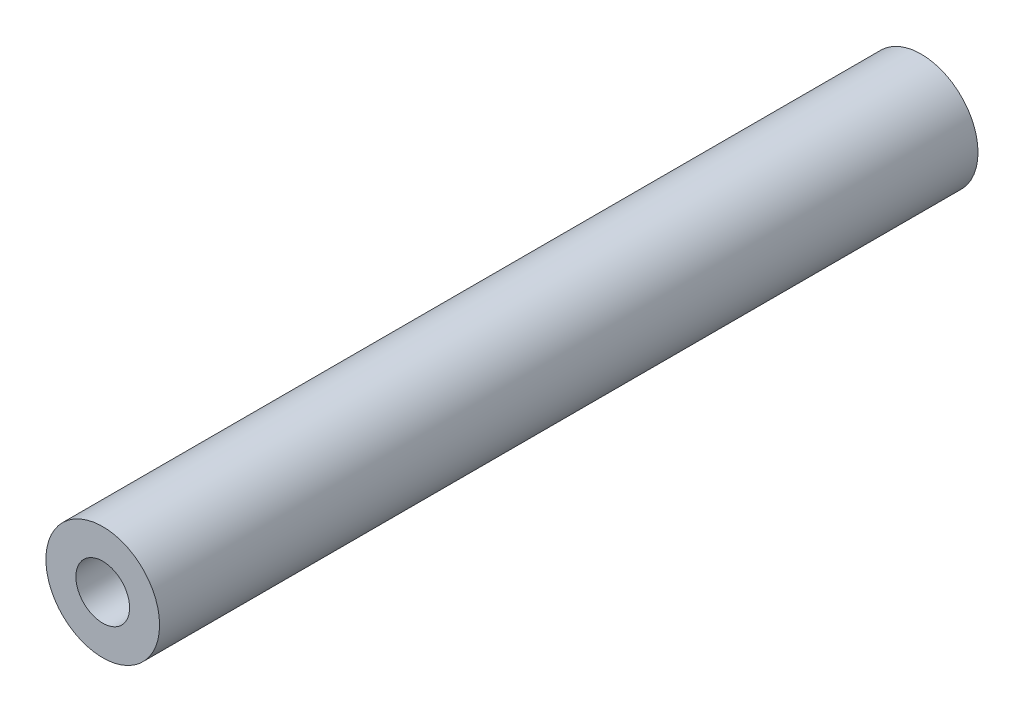
ISO-10303-21;
HEADER;
FILE_DESCRIPTION(('STEP AP214'),'2;1');
FILE_NAME('part.step','',(''),(''),'','','');
FILE_SCHEMA(('AUTOMOTIVE_DESIGN { 1 0 10303 214 1 1 1 1 }'));
ENDSEC;
DATA;
#1=APPLICATION_CONTEXT('core data for automotive mechanical design processes');
#2=APPLICATION_PROTOCOL_DEFINITION('international standard','automotive_design',2000,#1);
#3=PRODUCT_CONTEXT('',#1,'mechanical');
#4=PRODUCT('Part','Part','',(#3));
#5=PRODUCT_RELATED_PRODUCT_CATEGORY('part','',(#4));
#6=PRODUCT_DEFINITION_FORMATION('','',#4);
#7=PRODUCT_DEFINITION_CONTEXT('part definition',#1,'design');
#8=PRODUCT_DEFINITION('design','',#6,#7);
#9=PRODUCT_DEFINITION_SHAPE('','',#8);
#10=(LENGTH_UNIT() NAMED_UNIT(*) SI_UNIT(.MILLI.,.METRE.));
#11=(NAMED_UNIT(*) PLANE_ANGLE_UNIT() SI_UNIT($,.RADIAN.));
#12=(NAMED_UNIT(*) SI_UNIT($,.STERADIAN.) SOLID_ANGLE_UNIT());
#13=UNCERTAINTY_MEASURE_WITH_UNIT(LENGTH_MEASURE(1.E-05),#10,'distance_accuracy_value','');
#14=(GEOMETRIC_REPRESENTATION_CONTEXT(3) GLOBAL_UNCERTAINTY_ASSIGNED_CONTEXT((#13)) GLOBAL_UNIT_ASSIGNED_CONTEXT((#10,
#11,#12)) REPRESENTATION_CONTEXT('',''));
#15=CARTESIAN_POINT('',(0.,0.,0.));
#16=DIRECTION('',(0.,0.,1.));
#17=DIRECTION('',(1.,0.,0.));
#18=AXIS2_PLACEMENT_3D('',#15,#16,#17);
#19=CARTESIAN_POINT('',(0.,0.,45.72));
#20=DIRECTION('',(0.,0.,1.));
#21=DIRECTION('',(1.,0.,0.));
#22=AXIS2_PLACEMENT_3D('',#19,#20,#21);
#23=PLANE('',#22);
#24=CARTESIAN_POINT('',(0.,0.,45.72));
#25=DIRECTION('',(0.,0.,1.));
#26=DIRECTION('',(1.,0.,0.));
#27=AXIS2_PLACEMENT_3D('',#24,#25,#26);
#28=CIRCLE('',#27,3.175);
#29=CARTESIAN_POINT('',(3.175,0.,45.72));
#30=VERTEX_POINT('',#29);
#31=EDGE_CURVE('E10',#30,#30,#28,.T.);
#32=ORIENTED_EDGE('',*,*,#31,.T.);
#33=EDGE_LOOP('',(#32));
#34=FACE_BOUND('',#33,.T.);
#35=CARTESIAN_POINT('',(0.,0.,45.72));
#36=DIRECTION('',(0.,0.,1.));
#37=DIRECTION('',(1.,0.,0.));
#38=AXIS2_PLACEMENT_3D('',#35,#36,#37);
#39=CIRCLE('',#38,1.5);
#40=CARTESIAN_POINT('',(1.5,0.,45.72));
#41=VERTEX_POINT('',#40);
#42=EDGE_CURVE('E50',#41,#41,#39,.T.);
#43=ORIENTED_EDGE('',*,*,#42,.F.);
#44=EDGE_LOOP('',(#43));
#45=FACE_BOUND('',#44,.T.);
#46=ADVANCED_FACE('F37',(#34,#45),#23,.T.);
#47=CARTESIAN_POINT('',(0.,0.,0.));
#48=DIRECTION('',(0.,0.,1.));
#49=DIRECTION('',(1.,0.,0.));
#50=AXIS2_PLACEMENT_3D('',#47,#48,#49);
#51=PLANE('',#50);
#52=CARTESIAN_POINT('',(0.,0.,0.));
#53=DIRECTION('',(0.,0.,1.));
#54=DIRECTION('',(1.,0.,0.));
#55=AXIS2_PLACEMENT_3D('',#52,#53,#54);
#56=CIRCLE('',#55,3.175);
#57=CARTESIAN_POINT('',(3.175,0.,0.));
#58=VERTEX_POINT('',#57);
#59=EDGE_CURVE('E41',#58,#58,#56,.T.);
#60=ORIENTED_EDGE('',*,*,#59,.F.);
#61=EDGE_LOOP('',(#60));
#62=FACE_BOUND('',#61,.T.);
#63=CARTESIAN_POINT('',(0.,0.,0.));
#64=DIRECTION('',(0.,0.,1.));
#65=DIRECTION('',(1.,0.,0.));
#66=AXIS2_PLACEMENT_3D('',#63,#64,#65);
#67=CIRCLE('',#66,1.5);
#68=CARTESIAN_POINT('',(1.5,0.,0.));
#69=VERTEX_POINT('',#68);
#70=EDGE_CURVE('E52',#69,#69,#67,.T.);
#71=ORIENTED_EDGE('',*,*,#70,.T.);
#72=EDGE_LOOP('',(#71));
#73=FACE_BOUND('',#72,.T.);
#74=ADVANCED_FACE('F64',(#62,#73),#51,.F.);
#75=CARTESIAN_POINT('',(0.,0.,45.72));
#76=DIRECTION('',(0.,0.,-1.));
#77=DIRECTION('',(-1.,0.,0.));
#78=AXIS2_PLACEMENT_3D('',#75,#76,#77);
#79=CYLINDRICAL_SURFACE('',#78,3.175);
#80=ORIENTED_EDGE('',*,*,#31,.F.);
#81=EDGE_LOOP('',(#80));
#82=FACE_BOUND('',#81,.T.);
#83=ORIENTED_EDGE('',*,*,#59,.T.);
#84=EDGE_LOOP('',(#83));
#85=FACE_BOUND('',#84,.T.);
#86=ADVANCED_FACE('F39',(#82,#85),#79,.T.);
#87=CARTESIAN_POINT('',(0.,0.,45.72));
#88=DIRECTION('',(0.,0.,-1.));
#89=DIRECTION('',(-1.,0.,0.));
#90=AXIS2_PLACEMENT_3D('',#87,#88,#89);
#91=CYLINDRICAL_SURFACE('',#90,1.5);
#92=ORIENTED_EDGE('',*,*,#42,.T.);
#93=EDGE_LOOP('',(#92));
#94=FACE_BOUND('',#93,.T.);
#95=ORIENTED_EDGE('',*,*,#70,.F.);
#96=EDGE_LOOP('',(#95));
#97=FACE_BOUND('',#96,.T.);
#98=ADVANCED_FACE('F60',(#94,#97),#91,.F.);
#99=CLOSED_SHELL('',(#46,#74,#86,#98));
#100=MANIFOLD_SOLID_BREP('B2',#99);
#101=ADVANCED_BREP_SHAPE_REPRESENTATION('',(#18,#100),#14);
#102=SHAPE_DEFINITION_REPRESENTATION(#9,#101);
ENDSEC;
END-ISO-10303-21;
